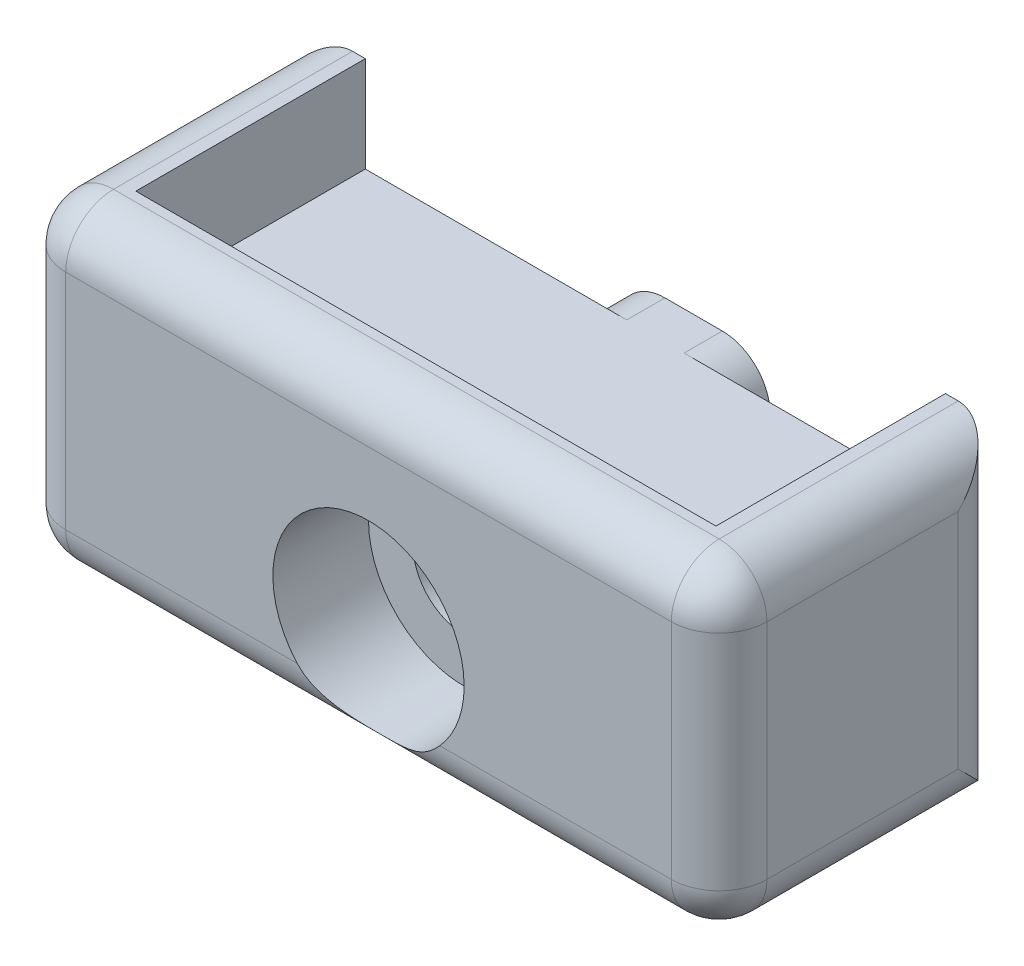
ISO-10303-21;
HEADER;
FILE_DESCRIPTION(('STEP AP214'),'2;1');
FILE_NAME('part.step','',(''),(''),'','','');
FILE_SCHEMA(('AUTOMOTIVE_DESIGN { 1 0 10303 214 1 1 1 1 }'));
ENDSEC;
DATA;
#1=APPLICATION_CONTEXT('core data for automotive mechanical design processes');
#2=APPLICATION_PROTOCOL_DEFINITION('international standard','automotive_design',2000,#1);
#3=PRODUCT_CONTEXT('',#1,'mechanical');
#4=PRODUCT('Part','Part','',(#3));
#5=PRODUCT_RELATED_PRODUCT_CATEGORY('part','',(#4));
#6=PRODUCT_DEFINITION_FORMATION('','',#4);
#7=PRODUCT_DEFINITION_CONTEXT('part definition',#1,'design');
#8=PRODUCT_DEFINITION('design','',#6,#7);
#9=PRODUCT_DEFINITION_SHAPE('','',#8);
#10=(LENGTH_UNIT() NAMED_UNIT(*) SI_UNIT(.MILLI.,.METRE.));
#11=(NAMED_UNIT(*) PLANE_ANGLE_UNIT() SI_UNIT($,.RADIAN.));
#12=(NAMED_UNIT(*) SI_UNIT($,.STERADIAN.) SOLID_ANGLE_UNIT());
#13=UNCERTAINTY_MEASURE_WITH_UNIT(LENGTH_MEASURE(1.E-05),#10,'distance_accuracy_value','');
#14=(GEOMETRIC_REPRESENTATION_CONTEXT(3) GLOBAL_UNCERTAINTY_ASSIGNED_CONTEXT((#13)) GLOBAL_UNIT_ASSIGNED_CONTEXT((#10,
#11,#12)) REPRESENTATION_CONTEXT('',''));
#15=CARTESIAN_POINT('',(0.,0.,0.));
#16=DIRECTION('',(0.,0.,1.));
#17=DIRECTION('',(1.,0.,0.));
#18=AXIS2_PLACEMENT_3D('',#15,#16,#17);
#19=CARTESIAN_POINT('',(0.,3.5,9.));
#20=DIRECTION('',(0.,0.,-1.));
#21=DIRECTION('',(-1.,0.,0.));
#22=AXIS2_PLACEMENT_3D('',#19,#20,#21);
#23=CYLINDRICAL_SURFACE('',#22,1.6);
#24=CARTESIAN_POINT('',(0.,3.5,-1.2));
#25=DIRECTION('',(0.,0.,-1.));
#26=DIRECTION('',(-1.,0.,0.));
#27=AXIS2_PLACEMENT_3D('',#24,#25,#26);
#28=CIRCLE('',#27,1.6);
#29=CARTESIAN_POINT('',(-1.6,3.5,-1.2));
#30=VERTEX_POINT('',#29);
#31=EDGE_CURVE('E223',#30,#30,#28,.T.);
#32=ORIENTED_EDGE('',*,*,#31,.T.);
#33=EDGE_LOOP('',(#32));
#34=FACE_BOUND('',#33,.T.);
#35=CARTESIAN_POINT('',(0.,3.5,6.));
#36=DIRECTION('',(0.,0.,1.));
#37=DIRECTION('',(1.,0.,0.));
#38=AXIS2_PLACEMENT_3D('',#35,#36,#37);
#39=CIRCLE('',#38,1.6);
#40=CARTESIAN_POINT('',(1.6,3.5,6.));
#41=VERTEX_POINT('',#40);
#42=EDGE_CURVE('E259',#41,#41,#39,.F.);
#43=ORIENTED_EDGE('',*,*,#42,.F.);
#44=EDGE_LOOP('',(#43));
#45=FACE_BOUND('',#44,.T.);
#46=ADVANCED_FACE('F33',(#34,#45),#23,.F.);
#47=CARTESIAN_POINT('',(2.4,10.,-1.2));
#48=DIRECTION('',(-1.,0.,0.));
#49=DIRECTION('',(0.,0.,1.));
#50=AXIS2_PLACEMENT_3D('',#47,#48,#49);
#51=PLANE('',#50);
#52=DIRECTION('',(0.,-1.,0.));
#53=VECTOR('',#52,1.);
#54=CARTESIAN_POINT('',(2.4,10.,-1.2));
#55=LINE('',#54,#53);
#56=CARTESIAN_POINT('',(2.4,5.5,-1.2));
#57=VERTEX_POINT('',#56);
#58=CARTESIAN_POINT('',(2.4,1.5,-1.2));
#59=VERTEX_POINT('',#58);
#60=EDGE_CURVE('E250',#57,#59,#55,.T.);
#61=ORIENTED_EDGE('',*,*,#60,.F.);
#62=DIRECTION('',(0.,0.,-1.));
#63=VECTOR('',#62,1.);
#64=CARTESIAN_POINT('',(2.4,5.5,0.));
#65=LINE('',#64,#63);
#66=CARTESIAN_POINT('',(2.4,5.5,0.));
#67=VERTEX_POINT('',#66);
#68=EDGE_CURVE('E323',#57,#67,#65,.F.);
#69=ORIENTED_EDGE('',*,*,#68,.T.);
#70=DIRECTION('',(0.,-1.,0.));
#71=VECTOR('',#70,1.);
#72=CARTESIAN_POINT('',(2.4,10.,0.));
#73=LINE('',#72,#71);
#74=CARTESIAN_POINT('',(2.4,1.5,0.));
#75=VERTEX_POINT('',#74);
#76=EDGE_CURVE('E253',#67,#75,#73,.T.);
#77=ORIENTED_EDGE('',*,*,#76,.T.);
#78=DIRECTION('',(0.,0.,-1.));
#79=VECTOR('',#78,1.);
#80=CARTESIAN_POINT('',(2.4,1.5,-1.2));
#81=LINE('',#80,#79);
#82=EDGE_CURVE('E320',#75,#59,#81,.T.);
#83=ORIENTED_EDGE('',*,*,#82,.T.);
#84=EDGE_LOOP('',(#61,#69,#77,#83));
#85=FACE_BOUND('',#84,.T.);
#86=ADVANCED_FACE('F358',(#85),#51,.F.);
#87=CARTESIAN_POINT('',(-2.4,10.,-1.2));
#88=DIRECTION('',(0.,0.,1.));
#89=DIRECTION('',(1.,0.,0.));
#90=AXIS2_PLACEMENT_3D('',#87,#88,#89);
#91=PLANE('',#90);
#92=ORIENTED_EDGE('',*,*,#31,.F.);
#93=EDGE_LOOP('',(#92));
#94=FACE_BOUND('',#93,.T.);
#95=DIRECTION('',(0.,-1.,0.));
#96=VECTOR('',#95,1.);
#97=CARTESIAN_POINT('',(-2.4,10.,-1.2));
#98=LINE('',#97,#96);
#99=CARTESIAN_POINT('',(-2.4,5.5,-1.2));
#100=VERTEX_POINT('',#99);
#101=CARTESIAN_POINT('',(-2.4,1.5,-1.2));
#102=VERTEX_POINT('',#101);
#103=EDGE_CURVE('E247',#100,#102,#98,.T.);
#104=ORIENTED_EDGE('',*,*,#103,.F.);
#105=CARTESIAN_POINT('',(-0.9,5.5,-1.2));
#106=DIRECTION('',(0.,0.,1.));
#107=DIRECTION('',(1.,0.,0.));
#108=AXIS2_PLACEMENT_3D('',#105,#106,#107);
#109=CIRCLE('',#108,1.5);
#110=CARTESIAN_POINT('',(-0.9,7.,-1.2));
#111=VERTEX_POINT('',#110);
#112=EDGE_CURVE('E318',#100,#111,#109,.F.);
#113=ORIENTED_EDGE('',*,*,#112,.T.);
#114=DIRECTION('',(-1.,0.,0.));
#115=VECTOR('',#114,1.);
#116=CARTESIAN_POINT('',(-9.1,7.,-1.2));
#117=LINE('',#116,#115);
#118=CARTESIAN_POINT('',(0.9,7.,-1.2));
#119=VERTEX_POINT('',#118);
#120=EDGE_CURVE('E211',#119,#111,#117,.T.);
#121=ORIENTED_EDGE('',*,*,#120,.F.);
#122=CARTESIAN_POINT('',(0.9,5.5,-1.2));
#123=DIRECTION('',(0.,0.,1.));
#124=DIRECTION('',(1.,0.,0.));
#125=AXIS2_PLACEMENT_3D('',#122,#123,#124);
#126=CIRCLE('',#125,1.5);
#127=EDGE_CURVE('E316',#119,#57,#126,.F.);
#128=ORIENTED_EDGE('',*,*,#127,.T.);
#129=ORIENTED_EDGE('',*,*,#60,.T.);
#130=CARTESIAN_POINT('',(0.9,1.5,-1.2));
#131=DIRECTION('',(0.,0.,1.));
#132=DIRECTION('',(1.,0.,0.));
#133=AXIS2_PLACEMENT_3D('',#130,#131,#132);
#134=CIRCLE('',#133,1.5);
#135=CARTESIAN_POINT('',(0.9,0.,-1.2));
#136=VERTEX_POINT('',#135);
#137=EDGE_CURVE('E314',#59,#136,#134,.F.);
#138=ORIENTED_EDGE('',*,*,#137,.T.);
#139=DIRECTION('',(-1.,0.,0.));
#140=VECTOR('',#139,1.);
#141=CARTESIAN_POINT('',(-2.4,0.,-1.2));
#142=LINE('',#141,#140);
#143=CARTESIAN_POINT('',(-0.9,0.,-1.2));
#144=VERTEX_POINT('',#143);
#145=EDGE_CURVE('E241',#136,#144,#142,.T.);
#146=ORIENTED_EDGE('',*,*,#145,.T.);
#147=CARTESIAN_POINT('',(-0.9,1.5,-1.2));
#148=DIRECTION('',(0.,0.,1.));
#149=DIRECTION('',(1.,0.,0.));
#150=AXIS2_PLACEMENT_3D('',#147,#148,#149);
#151=CIRCLE('',#150,1.5);
#152=EDGE_CURVE('E312',#144,#102,#151,.F.);
#153=ORIENTED_EDGE('',*,*,#152,.T.);
#154=EDGE_LOOP('',(#104,#113,#121,#128,#129,#138,#146,#153));
#155=FACE_BOUND('',#154,.T.);
#156=ADVANCED_FACE('F386',(#94,#155),#91,.F.);
#157=CARTESIAN_POINT('',(-2.4,10.,-1.2));
#158=DIRECTION('',(1.,0.,0.));
#159=DIRECTION('',(0.,0.,-1.));
#160=AXIS2_PLACEMENT_3D('',#157,#158,#159);
#161=PLANE('',#160);
#162=DIRECTION('',(0.,-1.,0.));
#163=VECTOR('',#162,1.);
#164=CARTESIAN_POINT('',(-2.4,10.,0.));
#165=LINE('',#164,#163);
#166=CARTESIAN_POINT('',(-2.4,5.5,0.));
#167=VERTEX_POINT('',#166);
#168=CARTESIAN_POINT('',(-2.4,1.5,0.));
#169=VERTEX_POINT('',#168);
#170=EDGE_CURVE('E239',#167,#169,#165,.T.);
#171=ORIENTED_EDGE('',*,*,#170,.F.);
#172=DIRECTION('',(0.,0.,1.));
#173=VECTOR('',#172,1.);
#174=CARTESIAN_POINT('',(-2.4,5.5,-1.2));
#175=LINE('',#174,#173);
#176=EDGE_CURVE('E310',#167,#100,#175,.F.);
#177=ORIENTED_EDGE('',*,*,#176,.T.);
#178=ORIENTED_EDGE('',*,*,#103,.T.);
#179=DIRECTION('',(0.,0.,1.));
#180=VECTOR('',#179,1.);
#181=CARTESIAN_POINT('',(-2.4,1.5,-1.2));
#182=LINE('',#181,#180);
#183=EDGE_CURVE('E307',#102,#169,#182,.T.);
#184=ORIENTED_EDGE('',*,*,#183,.T.);
#185=EDGE_LOOP('',(#171,#177,#178,#184));
#186=FACE_BOUND('',#185,.T.);
#187=ADVANCED_FACE('F382',(#186),#161,.F.);
#188=CARTESIAN_POINT('',(-11.,10.,0.));
#189=DIRECTION('',(1.,0.,0.));
#190=DIRECTION('',(0.,0.,-1.));
#191=AXIS2_PLACEMENT_3D('',#188,#189,#190);
#192=PLANE('',#191);
#193=DIRECTION('',(0.,-1.,0.));
#194=VECTOR('',#193,1.);
#195=CARTESIAN_POINT('',(-11.,10.,7.5));
#196=LINE('',#195,#194);
#197=CARTESIAN_POINT('',(-11.,1.5,7.5));
#198=VERTEX_POINT('',#197);
#199=CARTESIAN_POINT('',(-11.,8.5,7.5));
#200=VERTEX_POINT('',#199);
#201=EDGE_CURVE('E269',#198,#200,#196,.F.);
#202=ORIENTED_EDGE('',*,*,#201,.T.);
#203=DIRECTION('',(0.,0.,1.));
#204=VECTOR('',#203,1.);
#205=CARTESIAN_POINT('',(-11.,8.5,0.));
#206=LINE('',#205,#204);
#207=CARTESIAN_POINT('',(-11.,8.5,1.5));
#208=VERTEX_POINT('',#207);
#209=EDGE_CURVE('E275',#200,#208,#206,.F.);
#210=ORIENTED_EDGE('',*,*,#209,.T.);
#211=DIRECTION('',(0.,-1.,0.));
#212=VECTOR('',#211,1.);
#213=CARTESIAN_POINT('',(-11.,10.,1.5));
#214=LINE('',#213,#212);
#215=CARTESIAN_POINT('',(-11.,1.5,1.5));
#216=VERTEX_POINT('',#215);
#217=EDGE_CURVE('E273',#208,#216,#214,.T.);
#218=ORIENTED_EDGE('',*,*,#217,.T.);
#219=DIRECTION('',(0.,0.,1.));
#220=VECTOR('',#219,1.);
#221=CARTESIAN_POINT('',(-11.,1.5,0.));
#222=LINE('',#221,#220);
#223=EDGE_CURVE('E271',#216,#198,#222,.T.);
#224=ORIENTED_EDGE('',*,*,#223,.T.);
#225=EDGE_LOOP('',(#202,#210,#218,#224));
#226=FACE_BOUND('',#225,.T.);
#227=ADVANCED_FACE('F385',(#226),#192,.F.);
#228=CARTESIAN_POINT('',(-11.,10.,9.));
#229=DIRECTION('',(0.,0.,-1.));
#230=DIRECTION('',(-1.,0.,0.));
#231=AXIS2_PLACEMENT_3D('',#228,#229,#230);
#232=PLANE('',#231);
#233=CARTESIAN_POINT('',(0.,3.5,9.));
#234=DIRECTION('',(0.,0.,1.));
#235=DIRECTION('',(1.,0.,0.));
#236=AXIS2_PLACEMENT_3D('',#233,#234,#235);
#237=CIRCLE('',#236,3.);
#238=CARTESIAN_POINT('',(2.23606797749979,1.5,9.));
#239=VERTEX_POINT('',#238);
#240=CARTESIAN_POINT('',(-2.23606797749979,1.5,9.));
#241=VERTEX_POINT('',#240);
#242=EDGE_CURVE('E550',#239,#241,#237,.T.);
#243=ORIENTED_EDGE('',*,*,#242,.F.);
#244=DIRECTION('',(1.,0.,0.));
#245=VECTOR('',#244,1.);
#246=CARTESIAN_POINT('',(-11.,1.5,9.));
#247=LINE('',#246,#245);
#248=CARTESIAN_POINT('',(9.5,1.5,9.));
#249=VERTEX_POINT('',#248);
#250=EDGE_CURVE('E287',#239,#249,#247,.T.);
#251=ORIENTED_EDGE('',*,*,#250,.T.);
#252=DIRECTION('',(0.,-1.,0.));
#253=VECTOR('',#252,1.);
#254=CARTESIAN_POINT('',(9.5,10.,9.));
#255=LINE('',#254,#253);
#256=CARTESIAN_POINT('',(9.5,8.5,9.));
#257=VERTEX_POINT('',#256);
#258=EDGE_CURVE('E285',#249,#257,#255,.F.);
#259=ORIENTED_EDGE('',*,*,#258,.T.);
#260=DIRECTION('',(1.,0.,0.));
#261=VECTOR('',#260,1.);
#262=CARTESIAN_POINT('',(-11.,8.5,9.));
#263=LINE('',#262,#261);
#264=CARTESIAN_POINT('',(-9.5,8.5,9.));
#265=VERTEX_POINT('',#264);
#266=EDGE_CURVE('E282',#257,#265,#263,.F.);
#267=ORIENTED_EDGE('',*,*,#266,.T.);
#268=DIRECTION('',(0.,-1.,0.));
#269=VECTOR('',#268,1.);
#270=CARTESIAN_POINT('',(-9.5,10.,9.));
#271=LINE('',#270,#269);
#272=CARTESIAN_POINT('',(-9.5,1.5,9.));
#273=VERTEX_POINT('',#272);
#274=EDGE_CURVE('E278',#265,#273,#271,.T.);
#275=ORIENTED_EDGE('',*,*,#274,.T.);
#276=DIRECTION('',(1.,0.,0.));
#277=VECTOR('',#276,1.);
#278=CARTESIAN_POINT('',(-11.,1.5,9.));
#279=LINE('',#278,#277);
#280=EDGE_CURVE('E280',#273,#241,#279,.T.);
#281=ORIENTED_EDGE('',*,*,#280,.T.);
#282=EDGE_LOOP('',(#243,#251,#259,#267,#275,#281));
#283=FACE_BOUND('',#282,.T.);
#284=ADVANCED_FACE('F399',(#283),#232,.F.);
#285=CARTESIAN_POINT('',(11.,10.,0.));
#286=DIRECTION('',(-1.,0.,0.));
#287=DIRECTION('',(0.,0.,1.));
#288=AXIS2_PLACEMENT_3D('',#285,#286,#287);
#289=PLANE('',#288);
#290=DIRECTION('',(0.,-1.,0.));
#291=VECTOR('',#290,1.);
#292=CARTESIAN_POINT('',(11.,10.,1.5));
#293=LINE('',#292,#291);
#294=CARTESIAN_POINT('',(11.,1.5,1.5));
#295=VERTEX_POINT('',#294);
#296=CARTESIAN_POINT('',(11.,8.5,1.5));
#297=VERTEX_POINT('',#296);
#298=EDGE_CURVE('E293',#295,#297,#293,.F.);
#299=ORIENTED_EDGE('',*,*,#298,.T.);
#300=DIRECTION('',(0.,0.,-1.));
#301=VECTOR('',#300,1.);
#302=CARTESIAN_POINT('',(11.,8.5,9.));
#303=LINE('',#302,#301);
#304=CARTESIAN_POINT('',(11.,8.5,7.5));
#305=VERTEX_POINT('',#304);
#306=EDGE_CURVE('E295',#297,#305,#303,.F.);
#307=ORIENTED_EDGE('',*,*,#306,.T.);
#308=DIRECTION('',(0.,-1.,0.));
#309=VECTOR('',#308,1.);
#310=CARTESIAN_POINT('',(11.,10.,7.5));
#311=LINE('',#310,#309);
#312=CARTESIAN_POINT('',(11.,1.5,7.5));
#313=VERTEX_POINT('',#312);
#314=EDGE_CURVE('E289',#305,#313,#311,.T.);
#315=ORIENTED_EDGE('',*,*,#314,.T.);
#316=DIRECTION('',(0.,0.,-1.));
#317=VECTOR('',#316,1.);
#318=CARTESIAN_POINT('',(11.,1.5,0.));
#319=LINE('',#318,#317);
#320=EDGE_CURVE('E291',#313,#295,#319,.T.);
#321=ORIENTED_EDGE('',*,*,#320,.T.);
#322=EDGE_LOOP('',(#299,#307,#315,#321));
#323=FACE_BOUND('',#322,.T.);
#324=ADVANCED_FACE('F396',(#323),#289,.F.);
#325=CARTESIAN_POINT('',(2.4,10.,0.));
#326=DIRECTION('',(0.,0.,1.));
#327=DIRECTION('',(1.,0.,0.));
#328=AXIS2_PLACEMENT_3D('',#325,#326,#327);
#329=PLANE('',#328);
#330=DIRECTION('',(-1.,0.,0.));
#331=VECTOR('',#330,1.);
#332=CARTESIAN_POINT('',(2.4,10.,0.));
#333=LINE('',#332,#331);
#334=CARTESIAN_POINT('',(9.5,10.,0.));
#335=VERTEX_POINT('',#334);
#336=CARTESIAN_POINT('',(9.1,10.,0.));
#337=VERTEX_POINT('',#336);
#338=EDGE_CURVE('E234',#335,#337,#333,.T.);
#339=ORIENTED_EDGE('',*,*,#338,.F.);
#340=DIRECTION('',(0.,-1.,0.));
#341=VECTOR('',#340,1.);
#342=CARTESIAN_POINT('',(9.5,10.,0.));
#343=LINE('',#342,#341);
#344=CARTESIAN_POINT('',(9.5,0.,0.));
#345=VERTEX_POINT('',#344);
#346=EDGE_CURVE('E300',#335,#345,#343,.T.);
#347=ORIENTED_EDGE('',*,*,#346,.T.);
#348=DIRECTION('',(-1.,0.,0.));
#349=VECTOR('',#348,1.);
#350=CARTESIAN_POINT('',(2.4,0.,0.));
#351=LINE('',#350,#349);
#352=CARTESIAN_POINT('',(0.9,0.,0.));
#353=VERTEX_POINT('',#352);
#354=EDGE_CURVE('E50',#345,#353,#351,.T.);
#355=ORIENTED_EDGE('',*,*,#354,.T.);
#356=CARTESIAN_POINT('',(0.9,1.5,0.));
#357=DIRECTION('',(0.,0.,1.));
#358=DIRECTION('',(1.,0.,0.));
#359=AXIS2_PLACEMENT_3D('',#356,#357,#358);
#360=CIRCLE('',#359,1.5);
#361=EDGE_CURVE('E42',#353,#75,#360,.T.);
#362=ORIENTED_EDGE('',*,*,#361,.T.);
#363=ORIENTED_EDGE('',*,*,#76,.F.);
#364=CARTESIAN_POINT('',(0.9,5.5,0.));
#365=DIRECTION('',(0.,0.,1.));
#366=DIRECTION('',(1.,0.,0.));
#367=AXIS2_PLACEMENT_3D('',#364,#365,#366);
#368=CIRCLE('',#367,1.5);
#369=CARTESIAN_POINT('',(0.9,7.,0.));
#370=VERTEX_POINT('',#369);
#371=EDGE_CURVE('E504',#67,#370,#368,.T.);
#372=ORIENTED_EDGE('',*,*,#371,.T.);
#373=DIRECTION('',(-1.,0.,0.));
#374=VECTOR('',#373,1.);
#375=CARTESIAN_POINT('',(2.4,7.,0.));
#376=LINE('',#375,#374);
#377=CARTESIAN_POINT('',(9.1,7.,0.));
#378=VERTEX_POINT('',#377);
#379=EDGE_CURVE('E232',#378,#370,#376,.T.);
#380=ORIENTED_EDGE('',*,*,#379,.F.);
#381=DIRECTION('',(0.,1.,0.));
#382=VECTOR('',#381,1.);
#383=CARTESIAN_POINT('',(9.1,10.,0.));
#384=LINE('',#383,#382);
#385=EDGE_CURVE('E226',#378,#337,#384,.T.);
#386=ORIENTED_EDGE('',*,*,#385,.T.);
#387=EDGE_LOOP('',(#339,#347,#355,#362,#363,#372,#380,#386));
#388=FACE_BOUND('',#387,.T.);
#389=ADVANCED_FACE('F380',(#388),#329,.F.);
#390=CARTESIAN_POINT('',(-11.,10.,0.));
#391=DIRECTION('',(0.,0.,1.));
#392=DIRECTION('',(1.,0.,0.));
#393=AXIS2_PLACEMENT_3D('',#390,#391,#392);
#394=PLANE('',#393);
#395=DIRECTION('',(-1.,0.,0.));
#396=VECTOR('',#395,1.);
#397=CARTESIAN_POINT('',(-11.,0.,0.));
#398=LINE('',#397,#396);
#399=CARTESIAN_POINT('',(-0.9,0.,0.));
#400=VERTEX_POINT('',#399);
#401=CARTESIAN_POINT('',(-9.5,0.,0.));
#402=VERTEX_POINT('',#401);
#403=EDGE_CURVE('E58',#400,#402,#398,.T.);
#404=ORIENTED_EDGE('',*,*,#403,.T.);
#405=DIRECTION('',(0.,-1.,0.));
#406=VECTOR('',#405,1.);
#407=CARTESIAN_POINT('',(-9.5,10.,0.));
#408=LINE('',#407,#406);
#409=CARTESIAN_POINT('',(-9.5,10.,0.));
#410=VERTEX_POINT('',#409);
#411=EDGE_CURVE('E298',#402,#410,#408,.F.);
#412=ORIENTED_EDGE('',*,*,#411,.T.);
#413=DIRECTION('',(-1.,0.,0.));
#414=VECTOR('',#413,1.);
#415=CARTESIAN_POINT('',(-11.,10.,0.));
#416=LINE('',#415,#414);
#417=CARTESIAN_POINT('',(-9.1,10.,0.));
#418=VERTEX_POINT('',#417);
#419=EDGE_CURVE('E236',#418,#410,#416,.T.);
#420=ORIENTED_EDGE('',*,*,#419,.F.);
#421=DIRECTION('',(0.,-1.,0.));
#422=VECTOR('',#421,1.);
#423=CARTESIAN_POINT('',(-9.1,10.,0.));
#424=LINE('',#423,#422);
#425=CARTESIAN_POINT('',(-9.1,7.,0.));
#426=VERTEX_POINT('',#425);
#427=EDGE_CURVE('E230',#418,#426,#424,.T.);
#428=ORIENTED_EDGE('',*,*,#427,.T.);
#429=DIRECTION('',(-1.,0.,0.));
#430=VECTOR('',#429,1.);
#431=CARTESIAN_POINT('',(-11.,7.,0.));
#432=LINE('',#431,#430);
#433=CARTESIAN_POINT('',(-0.9,7.,0.));
#434=VERTEX_POINT('',#433);
#435=EDGE_CURVE('E197',#434,#426,#432,.T.);
#436=ORIENTED_EDGE('',*,*,#435,.F.);
#437=CARTESIAN_POINT('',(-0.9,5.5,0.));
#438=DIRECTION('',(0.,0.,1.));
#439=DIRECTION('',(1.,0.,0.));
#440=AXIS2_PLACEMENT_3D('',#437,#438,#439);
#441=CIRCLE('',#440,1.5);
#442=EDGE_CURVE('E342',#434,#167,#441,.T.);
#443=ORIENTED_EDGE('',*,*,#442,.T.);
#444=ORIENTED_EDGE('',*,*,#170,.T.);
#445=CARTESIAN_POINT('',(-0.9,1.5,0.));
#446=DIRECTION('',(0.,0.,1.));
#447=DIRECTION('',(1.,0.,0.));
#448=AXIS2_PLACEMENT_3D('',#445,#446,#447);
#449=CIRCLE('',#448,1.5);
#450=EDGE_CURVE('E11',#169,#400,#449,.T.);
#451=ORIENTED_EDGE('',*,*,#450,.T.);
#452=EDGE_LOOP('',(#404,#412,#420,#428,#436,#443,#444,#451));
#453=FACE_BOUND('',#452,.T.);
#454=ADVANCED_FACE('F374',(#453),#394,.F.);
#455=CARTESIAN_POINT('',(0.,10.,0.));
#456=DIRECTION('',(0.,1.,0.));
#457=DIRECTION('',(0.,0.,1.));
#458=AXIS2_PLACEMENT_3D('',#455,#456,#457);
#459=PLANE('',#458);
#460=ORIENTED_EDGE('',*,*,#419,.T.);
#461=DIRECTION('',(0.,0.,1.));
#462=VECTOR('',#461,1.);
#463=CARTESIAN_POINT('',(-9.5,10.,9.));
#464=LINE('',#463,#462);
#465=CARTESIAN_POINT('',(-9.5,10.,7.5));
#466=VERTEX_POINT('',#465);
#467=EDGE_CURVE('E266',#410,#466,#464,.T.);
#468=ORIENTED_EDGE('',*,*,#467,.T.);
#469=DIRECTION('',(1.,0.,0.));
#470=VECTOR('',#469,1.);
#471=CARTESIAN_POINT('',(11.,10.,7.5));
#472=LINE('',#471,#470);
#473=CARTESIAN_POINT('',(9.5,10.,7.5));
#474=VERTEX_POINT('',#473);
#475=EDGE_CURVE('E264',#466,#474,#472,.T.);
#476=ORIENTED_EDGE('',*,*,#475,.T.);
#477=DIRECTION('',(0.,0.,-1.));
#478=VECTOR('',#477,1.);
#479=CARTESIAN_POINT('',(9.5,10.,0.));
#480=LINE('',#479,#478);
#481=EDGE_CURVE('E258',#474,#335,#480,.T.);
#482=ORIENTED_EDGE('',*,*,#481,.T.);
#483=ORIENTED_EDGE('',*,*,#338,.T.);
#484=DIRECTION('',(0.,0.,-1.));
#485=VECTOR('',#484,1.);
#486=CARTESIAN_POINT('',(9.1,10.,-1.2));
#487=LINE('',#486,#485);
#488=CARTESIAN_POINT('',(9.1,10.,7.2));
#489=VERTEX_POINT('',#488);
#490=EDGE_CURVE('E200',#489,#337,#487,.T.);
#491=ORIENTED_EDGE('',*,*,#490,.F.);
#492=DIRECTION('',(1.,0.,0.));
#493=VECTOR('',#492,1.);
#494=CARTESIAN_POINT('',(-9.1,10.,7.2));
#495=LINE('',#494,#493);
#496=CARTESIAN_POINT('',(-9.1,10.,7.2));
#497=VERTEX_POINT('',#496);
#498=EDGE_CURVE('E221',#497,#489,#495,.T.);
#499=ORIENTED_EDGE('',*,*,#498,.F.);
#500=DIRECTION('',(0.,0.,1.));
#501=VECTOR('',#500,1.);
#502=CARTESIAN_POINT('',(-9.1,10.,0.));
#503=LINE('',#502,#501);
#504=EDGE_CURVE('E206',#418,#497,#503,.T.);
#505=ORIENTED_EDGE('',*,*,#504,.F.);
#506=EDGE_LOOP('',(#460,#468,#476,#482,#483,#491,#499,#505));
#507=FACE_BOUND('',#506,.T.);
#508=ADVANCED_FACE('F371',(#507),#459,.T.);
#509=CARTESIAN_POINT('',(0.,0.,0.));
#510=DIRECTION('',(0.,1.,0.));
#511=DIRECTION('',(0.,0.,1.));
#512=AXIS2_PLACEMENT_3D('',#509,#510,#511);
#513=PLANE('',#512);
#514=ORIENTED_EDGE('',*,*,#145,.F.);
#515=DIRECTION('',(0.,0.,-1.));
#516=VECTOR('',#515,1.);
#517=CARTESIAN_POINT('',(0.9,0.,0.));
#518=LINE('',#517,#516);
#519=EDGE_CURVE('E333',#136,#353,#518,.F.);
#520=ORIENTED_EDGE('',*,*,#519,.T.);
#521=ORIENTED_EDGE('',*,*,#354,.F.);
#522=DIRECTION('',(0.,0.,-1.));
#523=VECTOR('',#522,1.);
#524=CARTESIAN_POINT('',(9.5,0.,0.));
#525=LINE('',#524,#523);
#526=CARTESIAN_POINT('',(9.5,0.,7.5));
#527=VERTEX_POINT('',#526);
#528=EDGE_CURVE('E329',#345,#527,#525,.F.);
#529=ORIENTED_EDGE('',*,*,#528,.T.);
#530=DIRECTION('',(1.,0.,0.));
#531=VECTOR('',#530,1.);
#532=CARTESIAN_POINT('',(0.,0.,7.5));
#533=LINE('',#532,#531);
#534=CARTESIAN_POINT('',(-9.5,0.,7.5));
#535=VERTEX_POINT('',#534);
#536=EDGE_CURVE('E325',#527,#535,#533,.F.);
#537=ORIENTED_EDGE('',*,*,#536,.T.);
#538=DIRECTION('',(0.,0.,1.));
#539=VECTOR('',#538,1.);
#540=CARTESIAN_POINT('',(-9.5,0.,0.));
#541=LINE('',#540,#539);
#542=EDGE_CURVE('E327',#535,#402,#541,.F.);
#543=ORIENTED_EDGE('',*,*,#542,.T.);
#544=ORIENTED_EDGE('',*,*,#403,.F.);
#545=DIRECTION('',(0.,0.,1.));
#546=VECTOR('',#545,1.);
#547=CARTESIAN_POINT('',(-0.9,0.,0.));
#548=LINE('',#547,#546);
#549=EDGE_CURVE('E331',#400,#144,#548,.F.);
#550=ORIENTED_EDGE('',*,*,#549,.T.);
#551=EDGE_LOOP('',(#514,#520,#521,#529,#537,#543,#544,#550));
#552=FACE_BOUND('',#551,.T.);
#553=ADVANCED_FACE('F362',(#552),#513,.F.);
#554=CARTESIAN_POINT('',(0.,7.,0.));
#555=DIRECTION('',(0.,1.,0.));
#556=DIRECTION('',(0.,0.,1.));
#557=AXIS2_PLACEMENT_3D('',#554,#555,#556);
#558=PLANE('',#557);
#559=ORIENTED_EDGE('',*,*,#120,.T.);
#560=DIRECTION('',(0.,0.,1.));
#561=VECTOR('',#560,1.);
#562=CARTESIAN_POINT('',(-0.9,7.,0.));
#563=LINE('',#562,#561);
#564=EDGE_CURVE('E305',#111,#434,#563,.T.);
#565=ORIENTED_EDGE('',*,*,#564,.T.);
#566=ORIENTED_EDGE('',*,*,#435,.T.);
#567=DIRECTION('',(0.,0.,1.));
#568=VECTOR('',#567,1.);
#569=CARTESIAN_POINT('',(-9.1,7.,-1.2));
#570=LINE('',#569,#568);
#571=CARTESIAN_POINT('',(-9.1,7.,7.2));
#572=VERTEX_POINT('',#571);
#573=EDGE_CURVE('E189',#426,#572,#570,.T.);
#574=ORIENTED_EDGE('',*,*,#573,.T.);
#575=DIRECTION('',(1.,0.,0.));
#576=VECTOR('',#575,1.);
#577=CARTESIAN_POINT('',(-9.1,7.,7.2));
#578=LINE('',#577,#576);
#579=CARTESIAN_POINT('',(9.1,7.,7.2));
#580=VERTEX_POINT('',#579);
#581=EDGE_CURVE('E195',#572,#580,#578,.T.);
#582=ORIENTED_EDGE('',*,*,#581,.T.);
#583=DIRECTION('',(0.,0.,-1.));
#584=VECTOR('',#583,1.);
#585=CARTESIAN_POINT('',(9.1,7.,-1.2));
#586=LINE('',#585,#584);
#587=EDGE_CURVE('E215',#580,#378,#586,.T.);
#588=ORIENTED_EDGE('',*,*,#587,.T.);
#589=ORIENTED_EDGE('',*,*,#379,.T.);
#590=DIRECTION('',(0.,0.,-1.));
#591=VECTOR('',#590,1.);
#592=CARTESIAN_POINT('',(0.9,7.,-1.2));
#593=LINE('',#592,#591);
#594=EDGE_CURVE('E302',#370,#119,#593,.T.);
#595=ORIENTED_EDGE('',*,*,#594,.T.);
#596=EDGE_LOOP('',(#559,#565,#566,#574,#582,#588,#589,#595));
#597=FACE_BOUND('',#596,.T.);
#598=ADVANCED_FACE('F192',(#597),#558,.T.);
#599=CARTESIAN_POINT('',(-9.1,7.,-1.2));
#600=DIRECTION('',(-1.,0.,0.));
#601=DIRECTION('',(0.,0.,1.));
#602=AXIS2_PLACEMENT_3D('',#599,#600,#601);
#603=PLANE('',#602);
#604=ORIENTED_EDGE('',*,*,#504,.T.);
#605=DIRECTION('',(0.,1.,0.));
#606=VECTOR('',#605,1.);
#607=CARTESIAN_POINT('',(-9.1,7.,7.2));
#608=LINE('',#607,#606);
#609=EDGE_CURVE('E203',#572,#497,#608,.T.);
#610=ORIENTED_EDGE('',*,*,#609,.F.);
#611=ORIENTED_EDGE('',*,*,#573,.F.);
#612=ORIENTED_EDGE('',*,*,#427,.F.);
#613=EDGE_LOOP('',(#604,#610,#611,#612));
#614=FACE_BOUND('',#613,.T.);
#615=ADVANCED_FACE('F204',(#614),#603,.F.);
#616=CARTESIAN_POINT('',(9.1,7.,-1.2));
#617=DIRECTION('',(1.,0.,0.));
#618=DIRECTION('',(0.,0.,-1.));
#619=AXIS2_PLACEMENT_3D('',#616,#617,#618);
#620=PLANE('',#619);
#621=ORIENTED_EDGE('',*,*,#587,.F.);
#622=DIRECTION('',(0.,1.,0.));
#623=VECTOR('',#622,1.);
#624=CARTESIAN_POINT('',(9.1,7.,7.2));
#625=LINE('',#624,#623);
#626=EDGE_CURVE('E210',#580,#489,#625,.T.);
#627=ORIENTED_EDGE('',*,*,#626,.T.);
#628=ORIENTED_EDGE('',*,*,#490,.T.);
#629=ORIENTED_EDGE('',*,*,#385,.F.);
#630=EDGE_LOOP('',(#621,#627,#628,#629));
#631=FACE_BOUND('',#630,.T.);
#632=ADVANCED_FACE('F363',(#631),#620,.F.);
#633=CARTESIAN_POINT('',(-9.1,7.,7.2));
#634=DIRECTION('',(0.,0.,1.));
#635=DIRECTION('',(1.,0.,0.));
#636=AXIS2_PLACEMENT_3D('',#633,#634,#635);
#637=PLANE('',#636);
#638=ORIENTED_EDGE('',*,*,#498,.T.);
#639=ORIENTED_EDGE('',*,*,#626,.F.);
#640=ORIENTED_EDGE('',*,*,#581,.F.);
#641=ORIENTED_EDGE('',*,*,#609,.T.);
#642=EDGE_LOOP('',(#638,#639,#640,#641));
#643=FACE_BOUND('',#642,.T.);
#644=ADVANCED_FACE('F213',(#643),#637,.F.);
#645=CARTESIAN_POINT('',(0.,3.5,6.));
#646=DIRECTION('',(0.,0.,1.));
#647=DIRECTION('',(1.,0.,0.));
#648=AXIS2_PLACEMENT_3D('',#645,#646,#647);
#649=PLANE('',#648);
#650=CARTESIAN_POINT('',(0.,3.5,6.));
#651=DIRECTION('',(0.,0.,1.));
#652=DIRECTION('',(1.,0.,0.));
#653=AXIS2_PLACEMENT_3D('',#650,#651,#652);
#654=CIRCLE('',#653,3.);
#655=CARTESIAN_POINT('',(3.,3.5,6.));
#656=VERTEX_POINT('',#655);
#657=EDGE_CURVE('E262',#656,#656,#654,.T.);
#658=ORIENTED_EDGE('',*,*,#657,.T.);
#659=EDGE_LOOP('',(#658));
#660=FACE_BOUND('',#659,.T.);
#661=ORIENTED_EDGE('',*,*,#42,.T.);
#662=EDGE_LOOP('',(#661));
#663=FACE_BOUND('',#662,.T.);
#664=ADVANCED_FACE('F354',(#660,#663),#649,.T.);
#665=CARTESIAN_POINT('',(0.,3.5,6.));
#666=DIRECTION('',(0.,0.,1.));
#667=DIRECTION('',(1.,0.,0.));
#668=AXIS2_PLACEMENT_3D('',#665,#666,#667);
#669=CYLINDRICAL_SURFACE('',#668,3.);
#670=ORIENTED_EDGE('',*,*,#657,.F.);
#671=EDGE_LOOP('',(#670));
#672=FACE_BOUND('',#671,.T.);
#673=ORIENTED_EDGE('',*,*,#242,.T.);
#674=CARTESIAN_POINT('',(-2.23606797749979,1.5,9.));
#675=CARTESIAN_POINT('',(-2.19345871837017,1.45235176210222,8.99999414739738));
#676=CARTESIAN_POINT('',(-2.14936178187337,1.40612449166016,8.99773150517615));
#677=CARTESIAN_POINT('',(-2.05856816006496,1.31680575857186,8.98944648615702));
#678=CARTESIAN_POINT('',(-2.01187602634443,1.2737090936903,8.98343051371917));
#679=CARTESIAN_POINT('',(-1.86872603248068,1.14973663058327,8.9609420090208));
#680=CARTESIAN_POINT('',(-1.76875912533337,1.0736941443335,8.94001360291498));
#681=CARTESIAN_POINT('',(-1.52257471793628,0.909399317856235,8.88251244355355));
#682=CARTESIAN_POINT('',(-1.37304549819833,0.827221757076165,8.84301608750551));
#683=CARTESIAN_POINT('',(-1.06171059762143,0.688987340033167,8.76435126909936));
#684=CARTESIAN_POINT('',(-0.899878622423454,0.632988369547686,8.72518371969577));
#685=CARTESIAN_POINT('',(-0.669297778187851,0.574869736066999,8.68090892559391));
#686=CARTESIAN_POINT('',(-0.604626773503546,0.560810836739458,8.66968408926752));
#687=CARTESIAN_POINT('',(-0.474088000762997,0.536954464509999,8.65012261687447));
#688=CARTESIAN_POINT('',(-0.408220936328873,0.52715456564108,8.64178433714999));
#689=CARTESIAN_POINT('',(-0.275864574970005,0.511970743601148,8.6286716609371));
#690=CARTESIAN_POINT('',(-0.209378384953897,0.506570997514311,8.62388450027336));
#691=CARTESIAN_POINT('',(-0.0760243350020801,0.500220739168308,8.61823967742526));
#692=CARTESIAN_POINT('',(-0.00915648667936221,0.499270092248204,8.61738189631033));
#693=CARTESIAN_POINT('',(0.124484733822312,0.501838393738763,8.61967704698244));
#694=CARTESIAN_POINT('',(0.191257968866927,0.505361322612798,8.62283355057216));
#695=CARTESIAN_POINT('',(0.324125565091311,0.516814674149788,8.63287303879848));
#696=CARTESIAN_POINT('',(0.390219883448635,0.524745373113806,8.63975625704349));
#697=CARTESIAN_POINT('',(0.587423816888597,0.555063832945455,8.66525104666395));
#698=CARTESIAN_POINT('',(0.716963952509409,0.583967358971315,8.68869261574201));
#699=CARTESIAN_POINT('',(0.92585042042887,0.645139231790366,8.73291880914749));
#700=CARTESIAN_POINT('',(1.00704910641337,0.672779183438334,8.7518141106726));
#701=CARTESIAN_POINT('',(1.16658470371102,0.734786994123299,8.79065605193098));
#702=CARTESIAN_POINT('',(1.24492082097176,0.769156703377941,8.81060297968413));
#703=CARTESIAN_POINT('',(1.47477010047555,0.881967881484025,8.86937925073019));
#704=CARTESIAN_POINT('',(1.62188313084891,0.970334676886074,8.90733504838184));
#705=CARTESIAN_POINT('',(1.84683400957408,1.13349641650109,8.95597539213388));
#706=CARTESIAN_POINT('',(1.92944548799387,1.20030550283067,8.97152917388056));
#707=CARTESIAN_POINT('',(2.04836081867567,1.30749366012692,8.98803712087763));
#708=CARTESIAN_POINT('',(2.08725209923589,1.34448180407555,8.99240484521687));
#709=CARTESIAN_POINT('',(2.16314208794654,1.42064520215414,8.9983868021396));
#710=CARTESIAN_POINT('',(2.20013848345547,1.45982301228245,8.99999774435586));
#711=CARTESIAN_POINT('',(2.23606797749979,1.5,9.));
#712=B_SPLINE_CURVE_WITH_KNOTS('',3,(#674,#675,#676,#677,#678,#679,#680,#681,#682,#683,#684,
#685,#686,#687,#688,#689,#690,#691,#692,#693,#694,#695,#696,#697,#698,#699,#700,#701,#702,#703,
#704,#705,#706,#707,#708,#709,#710,#711),.UNSPECIFIED.,.F.,.F.,(4,2,2,2,2,2,2,2,2,2,2,2,2,2,2,2,
2,2,4),(0.,0.191585530986139,0.382845047606953,0.763433838231704,1.28640326551019,
1.81052366962049,2.01174180997143,2.21284518385985,2.41322216003155,2.61359307135161,
2.81414239212471,3.0147042857499,3.4172820791181,3.68049986955955,3.94379012854752,
4.46795667040477,4.78923674922777,4.95064635248673,5.11224847273881),.UNSPECIFIED.);
#713=EDGE_CURVE('E335',#241,#239,#712,.T.);
#714=ORIENTED_EDGE('',*,*,#713,.T.);
#715=EDGE_LOOP('',(#673,#714));
#716=FACE_BOUND('',#715,.T.);
#717=ADVANCED_FACE('F348',(#672,#716),#669,.F.);
#718=CARTESIAN_POINT('',(9.5,1.5,0.));
#719=DIRECTION('',(0.,0.,-1.));
#720=DIRECTION('',(-1.,0.,0.));
#721=AXIS2_PLACEMENT_3D('',#718,#719,#720);
#722=CYLINDRICAL_SURFACE('',#721,1.5);
#723=CARTESIAN_POINT('',(9.5,1.5,7.5));
#724=DIRECTION('',(0.,0.,1.));
#725=DIRECTION('',(1.,0.,0.));
#726=AXIS2_PLACEMENT_3D('',#723,#724,#725);
#727=CIRCLE('',#726,1.5);
#728=EDGE_CURVE('E476',#527,#313,#727,.T.);
#729=ORIENTED_EDGE('',*,*,#728,.F.);
#730=ORIENTED_EDGE('',*,*,#528,.F.);
#731=CARTESIAN_POINT('',(9.5,1.5,1.5));
#732=DIRECTION('',(0.,0.707106781186547,-0.707106781186547));
#733=DIRECTION('',(0.,-0.707106781186547,-0.707106781186547));
#734=AXIS2_PLACEMENT_3D('',#731,#732,#733);
#735=ELLIPSE('',#734,2.12132034355964,1.5);
#736=EDGE_CURVE('E37',#295,#345,#735,.T.);
#737=ORIENTED_EDGE('',*,*,#736,.F.);
#738=ORIENTED_EDGE('',*,*,#320,.F.);
#739=EDGE_LOOP('',(#729,#730,#737,#738));
#740=FACE_BOUND('',#739,.T.);
#741=ADVANCED_FACE('F353',(#740),#722,.T.);
#742=CARTESIAN_POINT('',(9.5,10.,1.5));
#743=DIRECTION('',(0.,-1.,0.));
#744=DIRECTION('',(0.,0.,-1.));
#745=AXIS2_PLACEMENT_3D('',#742,#743,#744);
#746=CYLINDRICAL_SURFACE('',#745,1.5);
#747=ORIENTED_EDGE('',*,*,#736,.T.);
#748=ORIENTED_EDGE('',*,*,#346,.F.);
#749=CARTESIAN_POINT('',(9.5,8.5,1.5));
#750=DIRECTION('',(0.,-0.707106781186547,-0.707106781186547));
#751=DIRECTION('',(0.,-0.707106781186547,0.707106781186547));
#752=AXIS2_PLACEMENT_3D('',#749,#750,#751);
#753=ELLIPSE('',#752,2.12132034355964,1.5);
#754=EDGE_CURVE('E474',#297,#335,#753,.F.);
#755=ORIENTED_EDGE('',*,*,#754,.F.);
#756=ORIENTED_EDGE('',*,*,#298,.F.);
#757=EDGE_LOOP('',(#747,#748,#755,#756));
#758=FACE_BOUND('',#757,.T.);
#759=ADVANCED_FACE('F475',(#758),#746,.T.);
#760=CARTESIAN_POINT('',(9.5,1.5,7.5));
#761=DIRECTION('',(0.,0.,1.));
#762=DIRECTION('',(1.,0.,0.));
#763=AXIS2_PLACEMENT_3D('',#760,#761,#762);
#764=SPHERICAL_SURFACE('',#763,1.5);
#765=CARTESIAN_POINT('',(9.5,1.5,7.5));
#766=DIRECTION('',(1.,0.,0.));
#767=DIRECTION('',(0.,0.,-1.));
#768=AXIS2_PLACEMENT_3D('',#765,#766,#767);
#769=CIRCLE('',#768,1.5);
#770=EDGE_CURVE('E462',#527,#249,#769,.F.);
#771=ORIENTED_EDGE('',*,*,#770,.F.);
#772=ORIENTED_EDGE('',*,*,#728,.T.);
#773=CARTESIAN_POINT('',(9.5,1.5,7.5));
#774=DIRECTION('',(0.,-1.,0.));
#775=DIRECTION('',(0.,0.,-1.));
#776=AXIS2_PLACEMENT_3D('',#773,#774,#775);
#777=CIRCLE('',#776,1.5);
#778=EDGE_CURVE('E466',#249,#313,#777,.F.);
#779=ORIENTED_EDGE('',*,*,#778,.F.);
#780=EDGE_LOOP('',(#771,#772,#779));
#781=FACE_BOUND('',#780,.T.);
#782=ADVANCED_FACE('F589',(#781),#764,.T.);
#783=CARTESIAN_POINT('',(9.5,8.5,0.));
#784=DIRECTION('',(0.,0.,1.));
#785=DIRECTION('',(1.,0.,0.));
#786=AXIS2_PLACEMENT_3D('',#783,#784,#785);
#787=CYLINDRICAL_SURFACE('',#786,1.5);
#788=ORIENTED_EDGE('',*,*,#754,.T.);
#789=ORIENTED_EDGE('',*,*,#481,.F.);
#790=CARTESIAN_POINT('',(9.5,8.5,7.5));
#791=DIRECTION('',(0.,0.,1.));
#792=DIRECTION('',(1.,0.,0.));
#793=AXIS2_PLACEMENT_3D('',#790,#791,#792);
#794=CIRCLE('',#793,1.5);
#795=EDGE_CURVE('E448',#305,#474,#794,.T.);
#796=ORIENTED_EDGE('',*,*,#795,.F.);
#797=ORIENTED_EDGE('',*,*,#306,.F.);
#798=EDGE_LOOP('',(#788,#789,#796,#797));
#799=FACE_BOUND('',#798,.T.);
#800=ADVANCED_FACE('F461',(#799),#787,.T.);
#801=CARTESIAN_POINT('',(9.5,10.,7.5));
#802=DIRECTION('',(0.,-1.,0.));
#803=DIRECTION('',(0.,0.,-1.));
#804=AXIS2_PLACEMENT_3D('',#801,#802,#803);
#805=CYLINDRICAL_SURFACE('',#804,1.5);
#806=ORIENTED_EDGE('',*,*,#778,.T.);
#807=ORIENTED_EDGE('',*,*,#314,.F.);
#808=CARTESIAN_POINT('',(9.5,8.5,7.5));
#809=DIRECTION('',(0.,1.,0.));
#810=DIRECTION('',(0.,0.,1.));
#811=AXIS2_PLACEMENT_3D('',#808,#809,#810);
#812=CIRCLE('',#811,1.5);
#813=EDGE_CURVE('E446',#257,#305,#812,.T.);
#814=ORIENTED_EDGE('',*,*,#813,.F.);
#815=ORIENTED_EDGE('',*,*,#258,.F.);
#816=EDGE_LOOP('',(#806,#807,#814,#815));
#817=FACE_BOUND('',#816,.T.);
#818=ADVANCED_FACE('F441',(#817),#805,.T.);
#819=CARTESIAN_POINT('',(-11.,1.5,7.5));
#820=DIRECTION('',(1.,0.,0.));
#821=DIRECTION('',(0.,0.,-1.));
#822=AXIS2_PLACEMENT_3D('',#819,#820,#821);
#823=CYLINDRICAL_SURFACE('',#822,1.5);
#824=ORIENTED_EDGE('',*,*,#713,.F.);
#825=ORIENTED_EDGE('',*,*,#280,.F.);
#826=CARTESIAN_POINT('',(-9.5,1.5,7.5));
#827=DIRECTION('',(-1.,0.,0.));
#828=DIRECTION('',(0.,0.,1.));
#829=AXIS2_PLACEMENT_3D('',#826,#827,#828);
#830=CIRCLE('',#829,1.5);
#831=EDGE_CURVE('E455',#535,#273,#830,.T.);
#832=ORIENTED_EDGE('',*,*,#831,.F.);
#833=ORIENTED_EDGE('',*,*,#536,.F.);
#834=ORIENTED_EDGE('',*,*,#770,.T.);
#835=ORIENTED_EDGE('',*,*,#250,.F.);
#836=EDGE_LOOP('',(#824,#825,#832,#833,#834,#835));
#837=FACE_BOUND('',#836,.T.);
#838=ADVANCED_FACE('F344',(#837),#823,.T.);
#839=CARTESIAN_POINT('',(9.5,8.5,7.5));
#840=DIRECTION('',(0.,0.,1.));
#841=DIRECTION('',(1.,0.,0.));
#842=AXIS2_PLACEMENT_3D('',#839,#840,#841);
#843=SPHERICAL_SURFACE('',#842,1.5);
#844=ORIENTED_EDGE('',*,*,#813,.T.);
#845=ORIENTED_EDGE('',*,*,#795,.T.);
#846=CARTESIAN_POINT('',(9.5,8.5,7.5));
#847=DIRECTION('',(1.,0.,0.));
#848=DIRECTION('',(0.,0.,-1.));
#849=AXIS2_PLACEMENT_3D('',#846,#847,#848);
#850=CIRCLE('',#849,1.5);
#851=EDGE_CURVE('E450',#257,#474,#850,.F.);
#852=ORIENTED_EDGE('',*,*,#851,.F.);
#853=EDGE_LOOP('',(#844,#845,#852));
#854=FACE_BOUND('',#853,.T.);
#855=ADVANCED_FACE('F434',(#854),#843,.T.);
#856=CARTESIAN_POINT('',(-9.5,1.5,7.5));
#857=DIRECTION('',(0.,0.,1.));
#858=DIRECTION('',(1.,0.,0.));
#859=AXIS2_PLACEMENT_3D('',#856,#857,#858);
#860=SPHERICAL_SURFACE('',#859,1.5);
#861=CARTESIAN_POINT('',(-9.5,1.5,7.5));
#862=DIRECTION('',(0.,-1.,0.));
#863=DIRECTION('',(0.,0.,-1.));
#864=AXIS2_PLACEMENT_3D('',#861,#862,#863);
#865=CIRCLE('',#864,1.5);
#866=EDGE_CURVE('E489',#198,#273,#865,.F.);
#867=ORIENTED_EDGE('',*,*,#866,.F.);
#868=CARTESIAN_POINT('',(-9.5,1.5,7.5));
#869=DIRECTION('',(0.,0.,1.));
#870=DIRECTION('',(1.,0.,0.));
#871=AXIS2_PLACEMENT_3D('',#868,#869,#870);
#872=CIRCLE('',#871,1.5);
#873=EDGE_CURVE('E485',#535,#198,#872,.F.);
#874=ORIENTED_EDGE('',*,*,#873,.F.);
#875=ORIENTED_EDGE('',*,*,#831,.T.);
#876=EDGE_LOOP('',(#867,#874,#875));
#877=FACE_BOUND('',#876,.T.);
#878=ADVANCED_FACE('F431',(#877),#860,.T.);
#879=CARTESIAN_POINT('',(-9.5,1.5,0.));
#880=DIRECTION('',(0.,0.,1.));
#881=DIRECTION('',(1.,0.,0.));
#882=AXIS2_PLACEMENT_3D('',#879,#880,#881);
#883=CYLINDRICAL_SURFACE('',#882,1.5);
#884=ORIENTED_EDGE('',*,*,#873,.T.);
#885=ORIENTED_EDGE('',*,*,#223,.F.);
#886=CARTESIAN_POINT('',(-9.5,1.5,1.5));
#887=DIRECTION('',(0.,-0.707106781186547,0.707106781186547));
#888=DIRECTION('',(0.,0.707106781186547,0.707106781186547));
#889=AXIS2_PLACEMENT_3D('',#886,#887,#888);
#890=ELLIPSE('',#889,2.12132034355964,1.5);
#891=EDGE_CURVE('E492',#402,#216,#890,.F.);
#892=ORIENTED_EDGE('',*,*,#891,.F.);
#893=ORIENTED_EDGE('',*,*,#542,.F.);
#894=EDGE_LOOP('',(#884,#885,#892,#893));
#895=FACE_BOUND('',#894,.T.);
#896=ADVANCED_FACE('F427',(#895),#883,.T.);
#897=CARTESIAN_POINT('',(0.,8.5,7.5));
#898=DIRECTION('',(-1.,0.,0.));
#899=DIRECTION('',(0.,0.,1.));
#900=AXIS2_PLACEMENT_3D('',#897,#898,#899);
#901=CYLINDRICAL_SURFACE('',#900,1.5);
#902=ORIENTED_EDGE('',*,*,#851,.T.);
#903=ORIENTED_EDGE('',*,*,#475,.F.);
#904=CARTESIAN_POINT('',(-9.5,8.5,7.5));
#905=DIRECTION('',(-1.,0.,0.));
#906=DIRECTION('',(0.,0.,1.));
#907=AXIS2_PLACEMENT_3D('',#904,#905,#906);
#908=CIRCLE('',#907,1.5);
#909=EDGE_CURVE('E495',#265,#466,#908,.T.);
#910=ORIENTED_EDGE('',*,*,#909,.F.);
#911=ORIENTED_EDGE('',*,*,#266,.F.);
#912=EDGE_LOOP('',(#902,#903,#910,#911));
#913=FACE_BOUND('',#912,.T.);
#914=ADVANCED_FACE('F423',(#913),#901,.T.);
#915=CARTESIAN_POINT('',(-9.5,10.,7.5));
#916=DIRECTION('',(0.,-1.,0.));
#917=DIRECTION('',(0.,0.,-1.));
#918=AXIS2_PLACEMENT_3D('',#915,#916,#917);
#919=CYLINDRICAL_SURFACE('',#918,1.5);
#920=ORIENTED_EDGE('',*,*,#866,.T.);
#921=ORIENTED_EDGE('',*,*,#274,.F.);
#922=CARTESIAN_POINT('',(-9.5,8.5,7.5));
#923=DIRECTION('',(0.,1.,0.));
#924=DIRECTION('',(0.,0.,1.));
#925=AXIS2_PLACEMENT_3D('',#922,#923,#924);
#926=CIRCLE('',#925,1.5);
#927=EDGE_CURVE('E498',#200,#265,#926,.T.);
#928=ORIENTED_EDGE('',*,*,#927,.F.);
#929=ORIENTED_EDGE('',*,*,#201,.F.);
#930=EDGE_LOOP('',(#920,#921,#928,#929));
#931=FACE_BOUND('',#930,.T.);
#932=ADVANCED_FACE('F419',(#931),#919,.T.);
#933=CARTESIAN_POINT('',(-9.5,10.,1.5));
#934=DIRECTION('',(0.,-1.,0.));
#935=DIRECTION('',(0.,0.,-1.));
#936=AXIS2_PLACEMENT_3D('',#933,#934,#935);
#937=CYLINDRICAL_SURFACE('',#936,1.5);
#938=ORIENTED_EDGE('',*,*,#891,.T.);
#939=ORIENTED_EDGE('',*,*,#217,.F.);
#940=CARTESIAN_POINT('',(-9.5,8.5,1.5));
#941=DIRECTION('',(0.,-0.707106781186547,-0.707106781186547));
#942=DIRECTION('',(0.,-0.707106781186547,0.707106781186547));
#943=AXIS2_PLACEMENT_3D('',#940,#941,#942);
#944=ELLIPSE('',#943,2.12132034355964,1.5);
#945=EDGE_CURVE('E500',#410,#208,#944,.F.);
#946=ORIENTED_EDGE('',*,*,#945,.F.);
#947=ORIENTED_EDGE('',*,*,#411,.F.);
#948=EDGE_LOOP('',(#938,#939,#946,#947));
#949=FACE_BOUND('',#948,.T.);
#950=ADVANCED_FACE('F415',(#949),#937,.T.);
#951=CARTESIAN_POINT('',(-9.5,8.5,7.5));
#952=DIRECTION('',(0.,0.,1.));
#953=DIRECTION('',(1.,0.,0.));
#954=AXIS2_PLACEMENT_3D('',#951,#952,#953);
#955=SPHERICAL_SURFACE('',#954,1.5);
#956=ORIENTED_EDGE('',*,*,#927,.T.);
#957=ORIENTED_EDGE('',*,*,#909,.T.);
#958=CARTESIAN_POINT('',(-9.5,8.5,7.5));
#959=DIRECTION('',(0.,0.,1.));
#960=DIRECTION('',(1.,0.,0.));
#961=AXIS2_PLACEMENT_3D('',#958,#959,#960);
#962=CIRCLE('',#961,1.5);
#963=EDGE_CURVE('E502',#200,#466,#962,.F.);
#964=ORIENTED_EDGE('',*,*,#963,.F.);
#965=EDGE_LOOP('',(#956,#957,#964));
#966=FACE_BOUND('',#965,.T.);
#967=ADVANCED_FACE('F411',(#966),#955,.T.);
#968=CARTESIAN_POINT('',(-9.5,8.5,0.));
#969=DIRECTION('',(0.,0.,-1.));
#970=DIRECTION('',(-1.,0.,0.));
#971=AXIS2_PLACEMENT_3D('',#968,#969,#970);
#972=CYLINDRICAL_SURFACE('',#971,1.5);
#973=ORIENTED_EDGE('',*,*,#945,.T.);
#974=ORIENTED_EDGE('',*,*,#209,.F.);
#975=ORIENTED_EDGE('',*,*,#963,.T.);
#976=ORIENTED_EDGE('',*,*,#467,.F.);
#977=EDGE_LOOP('',(#973,#974,#975,#976));
#978=FACE_BOUND('',#977,.T.);
#979=ADVANCED_FACE('F407',(#978),#972,.T.);
#980=CARTESIAN_POINT('',(-0.9,5.5,0.));
#981=DIRECTION('',(0.,0.,-1.));
#982=DIRECTION('',(-1.,0.,0.));
#983=AXIS2_PLACEMENT_3D('',#980,#981,#982);
#984=CYLINDRICAL_SURFACE('',#983,1.5);
#985=ORIENTED_EDGE('',*,*,#112,.F.);
#986=ORIENTED_EDGE('',*,*,#176,.F.);
#987=ORIENTED_EDGE('',*,*,#442,.F.);
#988=ORIENTED_EDGE('',*,*,#564,.F.);
#989=EDGE_LOOP('',(#985,#986,#987,#988));
#990=FACE_BOUND('',#989,.T.);
#991=ADVANCED_FACE('F410',(#990),#984,.T.);
#992=CARTESIAN_POINT('',(0.9,5.5,0.));
#993=DIRECTION('',(0.,0.,1.));
#994=DIRECTION('',(1.,0.,0.));
#995=AXIS2_PLACEMENT_3D('',#992,#993,#994);
#996=CYLINDRICAL_SURFACE('',#995,1.5);
#997=ORIENTED_EDGE('',*,*,#371,.F.);
#998=ORIENTED_EDGE('',*,*,#68,.F.);
#999=ORIENTED_EDGE('',*,*,#127,.F.);
#1000=ORIENTED_EDGE('',*,*,#594,.F.);
#1001=EDGE_LOOP('',(#997,#998,#999,#1000));
#1002=FACE_BOUND('',#1001,.T.);
#1003=ADVANCED_FACE('F521',(#1002),#996,.T.);
#1004=CARTESIAN_POINT('',(0.9,1.5,-1.2));
#1005=DIRECTION('',(0.,0.,-1.));
#1006=DIRECTION('',(-1.,0.,0.));
#1007=AXIS2_PLACEMENT_3D('',#1004,#1005,#1006);
#1008=CYLINDRICAL_SURFACE('',#1007,1.5);
#1009=ORIENTED_EDGE('',*,*,#361,.F.);
#1010=ORIENTED_EDGE('',*,*,#519,.F.);
#1011=ORIENTED_EDGE('',*,*,#137,.F.);
#1012=ORIENTED_EDGE('',*,*,#82,.F.);
#1013=EDGE_LOOP('',(#1009,#1010,#1011,#1012));
#1014=FACE_BOUND('',#1013,.T.);
#1015=ADVANCED_FACE('F527',(#1014),#1008,.T.);
#1016=CARTESIAN_POINT('',(-0.9,1.5,-1.2));
#1017=DIRECTION('',(0.,0.,1.));
#1018=DIRECTION('',(1.,0.,0.));
#1019=AXIS2_PLACEMENT_3D('',#1016,#1017,#1018);
#1020=CYLINDRICAL_SURFACE('',#1019,1.5);
#1021=ORIENTED_EDGE('',*,*,#152,.F.);
#1022=ORIENTED_EDGE('',*,*,#549,.F.);
#1023=ORIENTED_EDGE('',*,*,#450,.F.);
#1024=ORIENTED_EDGE('',*,*,#183,.F.);
#1025=EDGE_LOOP('',(#1021,#1022,#1023,#1024));
#1026=FACE_BOUND('',#1025,.T.);
#1027=ADVANCED_FACE('F35',(#1026),#1020,.T.);
#1028=CLOSED_SHELL('',(#46,#86,#156,#187,#227,#284,#324,#389,#454,#508,#553,#598,#615,#632,#644,
#664,#717,#741,#759,#782,#800,#818,#838,#855,#878,#896,#914,#932,#950,#967,#979,#991,#1003,
#1015,#1027));
#1029=MANIFOLD_SOLID_BREP('B2',#1028);
#1030=ADVANCED_BREP_SHAPE_REPRESENTATION('',(#18,#1029),#14);
#1031=SHAPE_DEFINITION_REPRESENTATION(#9,#1030);
ENDSEC;
END-ISO-10303-21;
